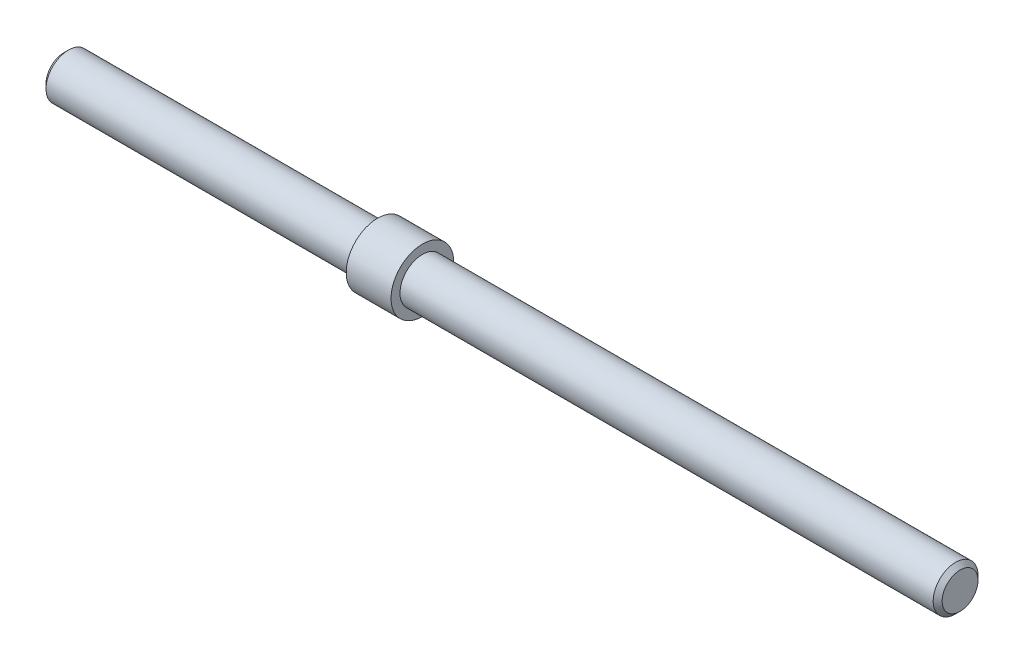
ISO-10303-21;
HEADER;
FILE_DESCRIPTION(('STEP AP214'),'2;1');
FILE_NAME('part.step','',(''),(''),'','','');
FILE_SCHEMA(('AUTOMOTIVE_DESIGN { 1 0 10303 214 1 1 1 1 }'));
ENDSEC;
DATA;
#1=APPLICATION_CONTEXT('core data for automotive mechanical design processes');
#2=APPLICATION_PROTOCOL_DEFINITION('international standard','automotive_design',2000,#1);
#3=PRODUCT_CONTEXT('',#1,'mechanical');
#4=PRODUCT('Part','Part','',(#3));
#5=PRODUCT_RELATED_PRODUCT_CATEGORY('part','',(#4));
#6=PRODUCT_DEFINITION_FORMATION('','',#4);
#7=PRODUCT_DEFINITION_CONTEXT('part definition',#1,'design');
#8=PRODUCT_DEFINITION('design','',#6,#7);
#9=PRODUCT_DEFINITION_SHAPE('','',#8);
#10=(LENGTH_UNIT() NAMED_UNIT(*) SI_UNIT(.MILLI.,.METRE.));
#11=(NAMED_UNIT(*) PLANE_ANGLE_UNIT() SI_UNIT($,.RADIAN.));
#12=(NAMED_UNIT(*) SI_UNIT($,.STERADIAN.) SOLID_ANGLE_UNIT());
#13=UNCERTAINTY_MEASURE_WITH_UNIT(LENGTH_MEASURE(1.E-05),#10,'distance_accuracy_value','');
#14=(GEOMETRIC_REPRESENTATION_CONTEXT(3) GLOBAL_UNCERTAINTY_ASSIGNED_CONTEXT((#13)) GLOBAL_UNIT_ASSIGNED_CONTEXT((#10,
#11,#12)) REPRESENTATION_CONTEXT('',''));
#15=CARTESIAN_POINT('',(0.,0.,0.));
#16=DIRECTION('',(0.,0.,1.));
#17=DIRECTION('',(1.,0.,0.));
#18=AXIS2_PLACEMENT_3D('',#15,#16,#17);
#19=CARTESIAN_POINT('',(200.,0.,0.));
#20=DIRECTION('',(-1.,0.,0.));
#21=DIRECTION('',(0.,0.,1.));
#22=AXIS2_PLACEMENT_3D('',#19,#20,#21);
#23=CYLINDRICAL_SURFACE('',#22,5.);
#24=CARTESIAN_POINT('',(80.,0.,0.));
#25=DIRECTION('',(1.,0.,0.));
#26=DIRECTION('',(0.,0.,-1.));
#27=AXIS2_PLACEMENT_3D('',#24,#25,#26);
#28=CIRCLE('',#27,5.);
#29=CARTESIAN_POINT('',(80.,0.,-5.));
#30=VERTEX_POINT('',#29);
#31=EDGE_CURVE('E46',#30,#30,#28,.T.);
#32=ORIENTED_EDGE('',*,*,#31,.T.);
#33=EDGE_LOOP('',(#32));
#34=FACE_BOUND('',#33,.T.);
#35=CARTESIAN_POINT('',(199.,0.,0.));
#36=DIRECTION('',(1.,0.,0.));
#37=DIRECTION('',(0.,0.,-1.));
#38=AXIS2_PLACEMENT_3D('',#35,#36,#37);
#39=CIRCLE('',#38,5.);
#40=CARTESIAN_POINT('',(199.,0.,-5.));
#41=VERTEX_POINT('',#40);
#42=EDGE_CURVE('E54',#41,#41,#39,.F.);
#43=ORIENTED_EDGE('',*,*,#42,.T.);
#44=EDGE_LOOP('',(#43));
#45=FACE_BOUND('',#44,.T.);
#46=ADVANCED_FACE('F41',(#34,#45),#23,.T.);
#47=CARTESIAN_POINT('',(200.,0.,0.));
#48=DIRECTION('',(1.,0.,0.));
#49=DIRECTION('',(0.,0.,-1.));
#50=AXIS2_PLACEMENT_3D('',#47,#48,#49);
#51=PLANE('',#50);
#52=CARTESIAN_POINT('',(200.,0.,0.));
#53=DIRECTION('',(1.,0.,0.));
#54=DIRECTION('',(0.,0.,-1.));
#55=AXIS2_PLACEMENT_3D('',#52,#53,#54);
#56=CIRCLE('',#55,4.);
#57=CARTESIAN_POINT('',(200.,0.,-4.));
#58=VERTEX_POINT('',#57);
#59=EDGE_CURVE('E62',#58,#58,#56,.T.);
#60=ORIENTED_EDGE('',*,*,#59,.T.);
#61=EDGE_LOOP('',(#60));
#62=FACE_BOUND('',#61,.T.);
#63=ADVANCED_FACE('F92',(#62),#51,.T.);
#64=CARTESIAN_POINT('',(200.,0.,0.));
#65=DIRECTION('',(-1.,0.,0.));
#66=DIRECTION('',(0.,0.,1.));
#67=AXIS2_PLACEMENT_3D('',#64,#65,#66);
#68=CONICAL_SURFACE('',#67,4.,0.78539816339746);
#69=ORIENTED_EDGE('',*,*,#42,.F.);
#70=EDGE_LOOP('',(#69));
#71=FACE_BOUND('',#70,.T.);
#72=ORIENTED_EDGE('',*,*,#59,.F.);
#73=EDGE_LOOP('',(#72));
#74=FACE_BOUND('',#73,.T.);
#75=ADVANCED_FACE('F88',(#71,#74),#68,.T.);
#76=CARTESIAN_POINT('',(80.,0.,0.));
#77=DIRECTION('',(-1.,0.,0.));
#78=DIRECTION('',(0.,0.,1.));
#79=AXIS2_PLACEMENT_3D('',#76,#77,#78);
#80=CYLINDRICAL_SURFACE('',#79,7.);
#81=CARTESIAN_POINT('',(80.,0.,0.));
#82=DIRECTION('',(1.,0.,0.));
#83=DIRECTION('',(0.,0.,-1.));
#84=AXIS2_PLACEMENT_3D('',#81,#82,#83);
#85=CIRCLE('',#84,7.);
#86=CARTESIAN_POINT('',(80.,0.,-7.));
#87=VERTEX_POINT('',#86);
#88=EDGE_CURVE('E68',#87,#87,#85,.T.);
#89=ORIENTED_EDGE('',*,*,#88,.F.);
#90=EDGE_LOOP('',(#89));
#91=FACE_BOUND('',#90,.T.);
#92=CARTESIAN_POINT('',(70.,0.,0.));
#93=DIRECTION('',(1.,0.,0.));
#94=DIRECTION('',(0.,0.,-1.));
#95=AXIS2_PLACEMENT_3D('',#92,#93,#94);
#96=CIRCLE('',#95,7.);
#97=CARTESIAN_POINT('',(70.,0.,-7.));
#98=VERTEX_POINT('',#97);
#99=EDGE_CURVE('E65',#98,#98,#96,.T.);
#100=ORIENTED_EDGE('',*,*,#99,.T.);
#101=EDGE_LOOP('',(#100));
#102=FACE_BOUND('',#101,.T.);
#103=ADVANCED_FACE('F80',(#91,#102),#80,.T.);
#104=CARTESIAN_POINT('',(80.,0.,0.));
#105=DIRECTION('',(1.,0.,0.));
#106=DIRECTION('',(0.,0.,-1.));
#107=AXIS2_PLACEMENT_3D('',#104,#105,#106);
#108=PLANE('',#107);
#109=ORIENTED_EDGE('',*,*,#31,.F.);
#110=EDGE_LOOP('',(#109));
#111=FACE_BOUND('',#110,.T.);
#112=ORIENTED_EDGE('',*,*,#88,.T.);
#113=EDGE_LOOP('',(#112));
#114=FACE_BOUND('',#113,.T.);
#115=ADVANCED_FACE('F77',(#111,#114),#108,.T.);
#116=CARTESIAN_POINT('',(70.,0.,0.));
#117=DIRECTION('',(1.,0.,0.));
#118=DIRECTION('',(0.,0.,-1.));
#119=AXIS2_PLACEMENT_3D('',#116,#117,#118);
#120=PLANE('',#119);
#121=CARTESIAN_POINT('',(70.,0.,0.));
#122=DIRECTION('',(1.,0.,0.));
#123=DIRECTION('',(0.,0.,-1.));
#124=AXIS2_PLACEMENT_3D('',#121,#122,#123);
#125=CIRCLE('',#124,5.);
#126=CARTESIAN_POINT('',(70.,0.,-5.));
#127=VERTEX_POINT('',#126);
#128=EDGE_CURVE('E10',#127,#127,#125,.T.);
#129=ORIENTED_EDGE('',*,*,#128,.T.);
#130=EDGE_LOOP('',(#129));
#131=FACE_BOUND('',#130,.T.);
#132=ORIENTED_EDGE('',*,*,#99,.F.);
#133=EDGE_LOOP('',(#132));
#134=FACE_BOUND('',#133,.T.);
#135=ADVANCED_FACE('F79',(#131,#134),#120,.F.);
#136=CARTESIAN_POINT('',(0.,0.,0.));
#137=DIRECTION('',(1.,0.,0.));
#138=DIRECTION('',(0.,0.,-1.));
#139=AXIS2_PLACEMENT_3D('',#136,#137,#138);
#140=PLANE('',#139);
#141=CARTESIAN_POINT('',(0.,0.,0.));
#142=DIRECTION('',(1.,0.,0.));
#143=DIRECTION('',(0.,0.,-1.));
#144=AXIS2_PLACEMENT_3D('',#141,#142,#143);
#145=CIRCLE('',#144,4.00000000000003);
#146=CARTESIAN_POINT('',(0.,0.,-4.00000000000003));
#147=VERTEX_POINT('',#146);
#148=EDGE_CURVE('E50',#147,#147,#145,.F.);
#149=ORIENTED_EDGE('',*,*,#148,.T.);
#150=EDGE_LOOP('',(#149));
#151=FACE_BOUND('',#150,.T.);
#152=ADVANCED_FACE('F86',(#151),#140,.F.);
#153=CARTESIAN_POINT('',(0.999999999999945,0.,0.));
#154=DIRECTION('',(1.,0.,0.));
#155=DIRECTION('',(0.,0.,-1.));
#156=AXIS2_PLACEMENT_3D('',#153,#154,#155);
#157=CONICAL_SURFACE('',#156,5.,0.78539816339746);
#158=ORIENTED_EDGE('',*,*,#148,.F.);
#159=EDGE_LOOP('',(#158));
#160=FACE_BOUND('',#159,.T.);
#161=CARTESIAN_POINT('',(0.999999999999945,0.,0.));
#162=DIRECTION('',(1.,0.,0.));
#163=DIRECTION('',(0.,0.,-1.));
#164=AXIS2_PLACEMENT_3D('',#161,#162,#163);
#165=CIRCLE('',#164,5.);
#166=CARTESIAN_POINT('',(0.999999999999945,0.,-5.));
#167=VERTEX_POINT('',#166);
#168=EDGE_CURVE('E59',#167,#167,#165,.T.);
#169=ORIENTED_EDGE('',*,*,#168,.F.);
#170=EDGE_LOOP('',(#169));
#171=FACE_BOUND('',#170,.T.);
#172=ADVANCED_FACE('F44',(#160,#171),#157,.T.);
#173=ORIENTED_EDGE('',*,*,#168,.T.);
#174=EDGE_LOOP('',(#173));
#175=FACE_BOUND('',#174,.T.);
#176=ORIENTED_EDGE('',*,*,#128,.F.);
#177=EDGE_LOOP('',(#176));
#178=FACE_BOUND('',#177,.T.);
#179=ADVANCED_FACE('F94',(#175,#178),#23,.T.);
#180=CLOSED_SHELL('',(#46,#63,#75,#103,#115,#135,#152,#172,#179));
#181=MANIFOLD_SOLID_BREP('B2',#180);
#182=ADVANCED_BREP_SHAPE_REPRESENTATION('',(#18,#181),#14);
#183=SHAPE_DEFINITION_REPRESENTATION(#9,#182);
ENDSEC;
END-ISO-10303-21;
